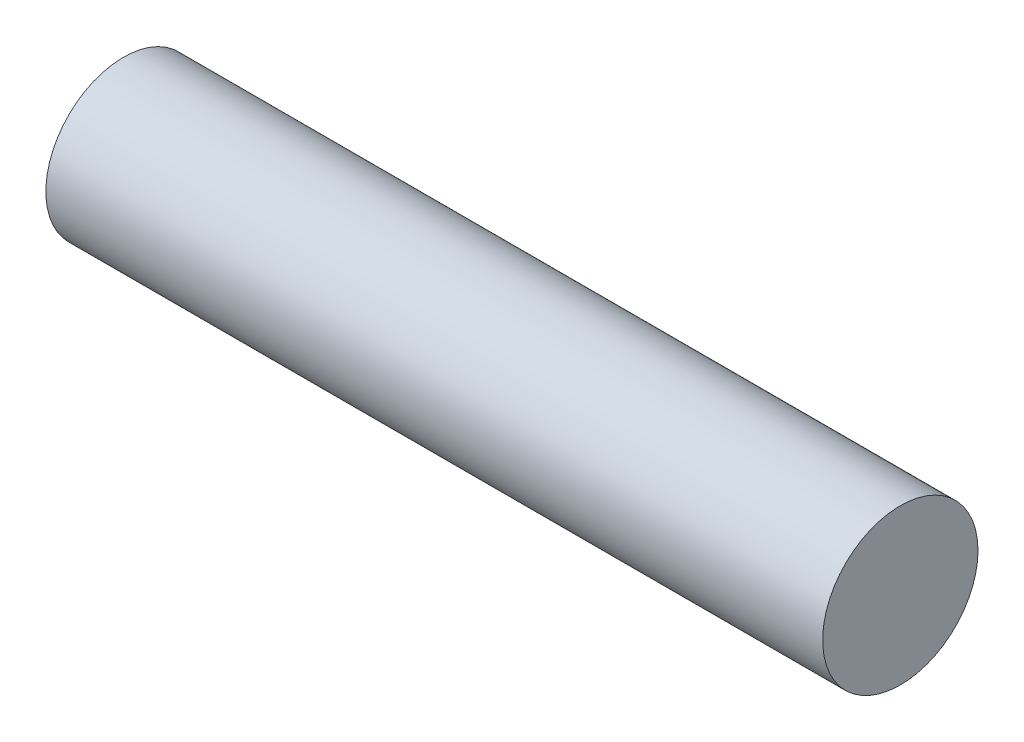
ISO-10303-21;
HEADER;
FILE_DESCRIPTION(('STEP AP214'),'2;1');
FILE_NAME('part.step','',(''),(''),'','','');
FILE_SCHEMA(('AUTOMOTIVE_DESIGN { 1 0 10303 214 1 1 1 1 }'));
ENDSEC;
DATA;
#1=APPLICATION_CONTEXT('core data for automotive mechanical design processes');
#2=APPLICATION_PROTOCOL_DEFINITION('international standard','automotive_design',2000,#1);
#3=PRODUCT_CONTEXT('',#1,'mechanical');
#4=PRODUCT('Part','Part','',(#3));
#5=PRODUCT_RELATED_PRODUCT_CATEGORY('part','',(#4));
#6=PRODUCT_DEFINITION_FORMATION('','',#4);
#7=PRODUCT_DEFINITION_CONTEXT('part definition',#1,'design');
#8=PRODUCT_DEFINITION('design','',#6,#7);
#9=PRODUCT_DEFINITION_SHAPE('','',#8);
#10=(LENGTH_UNIT() NAMED_UNIT(*) SI_UNIT(.MILLI.,.METRE.));
#11=(NAMED_UNIT(*) PLANE_ANGLE_UNIT() SI_UNIT($,.RADIAN.));
#12=(NAMED_UNIT(*) SI_UNIT($,.STERADIAN.) SOLID_ANGLE_UNIT());
#13=UNCERTAINTY_MEASURE_WITH_UNIT(LENGTH_MEASURE(1.E-05),#10,'distance_accuracy_value','');
#14=(GEOMETRIC_REPRESENTATION_CONTEXT(3) GLOBAL_UNCERTAINTY_ASSIGNED_CONTEXT((#13)) GLOBAL_UNIT_ASSIGNED_CONTEXT((#10,
#11,#12)) REPRESENTATION_CONTEXT('',''));
#15=CARTESIAN_POINT('',(0.,0.,0.));
#16=DIRECTION('',(0.,0.,1.));
#17=DIRECTION('',(1.,0.,0.));
#18=AXIS2_PLACEMENT_3D('',#15,#16,#17);
#19=CARTESIAN_POINT('',(150.,0.,0.));
#20=DIRECTION('',(-1.,0.,0.));
#21=DIRECTION('',(0.,0.,1.));
#22=AXIS2_PLACEMENT_3D('',#19,#20,#21);
#23=CYLINDRICAL_SURFACE('',#22,15.);
#24=CARTESIAN_POINT('',(150.,0.,0.));
#25=DIRECTION('',(1.,0.,0.));
#26=DIRECTION('',(0.,0.,-1.));
#27=AXIS2_PLACEMENT_3D('',#24,#25,#26);
#28=CIRCLE('',#27,15.);
#29=CARTESIAN_POINT('',(150.,0.,-15.));
#30=VERTEX_POINT('',#29);
#31=EDGE_CURVE('E10',#30,#30,#28,.T.);
#32=ORIENTED_EDGE('',*,*,#31,.F.);
#33=EDGE_LOOP('',(#32));
#34=FACE_BOUND('',#33,.T.);
#35=CARTESIAN_POINT('',(0.,0.,0.));
#36=DIRECTION('',(1.,0.,0.));
#37=DIRECTION('',(0.,0.,-1.));
#38=AXIS2_PLACEMENT_3D('',#35,#36,#37);
#39=CIRCLE('',#38,15.);
#40=CARTESIAN_POINT('',(0.,0.,-15.));
#41=VERTEX_POINT('',#40);
#42=EDGE_CURVE('E37',#41,#41,#39,.T.);
#43=ORIENTED_EDGE('',*,*,#42,.T.);
#44=EDGE_LOOP('',(#43));
#45=FACE_BOUND('',#44,.T.);
#46=ADVANCED_FACE('F40',(#34,#45),#23,.T.);
#47=CARTESIAN_POINT('',(150.,0.,0.));
#48=DIRECTION('',(1.,0.,0.));
#49=DIRECTION('',(0.,0.,-1.));
#50=AXIS2_PLACEMENT_3D('',#47,#48,#49);
#51=PLANE('',#50);
#52=ORIENTED_EDGE('',*,*,#31,.T.);
#53=EDGE_LOOP('',(#52));
#54=FACE_BOUND('',#53,.T.);
#55=ADVANCED_FACE('F55',(#54),#51,.T.);
#56=CARTESIAN_POINT('',(0.,0.,0.));
#57=DIRECTION('',(1.,0.,0.));
#58=DIRECTION('',(0.,0.,-1.));
#59=AXIS2_PLACEMENT_3D('',#56,#57,#58);
#60=PLANE('',#59);
#61=ORIENTED_EDGE('',*,*,#42,.F.);
#62=EDGE_LOOP('',(#61));
#63=FACE_BOUND('',#62,.T.);
#64=ADVANCED_FACE('F49',(#63),#60,.F.);
#65=CLOSED_SHELL('',(#46,#55,#64));
#66=MANIFOLD_SOLID_BREP('B2',#65);
#67=ADVANCED_BREP_SHAPE_REPRESENTATION('',(#18,#66),#14);
#68=SHAPE_DEFINITION_REPRESENTATION(#9,#67);
ENDSEC;
END-ISO-10303-21;
